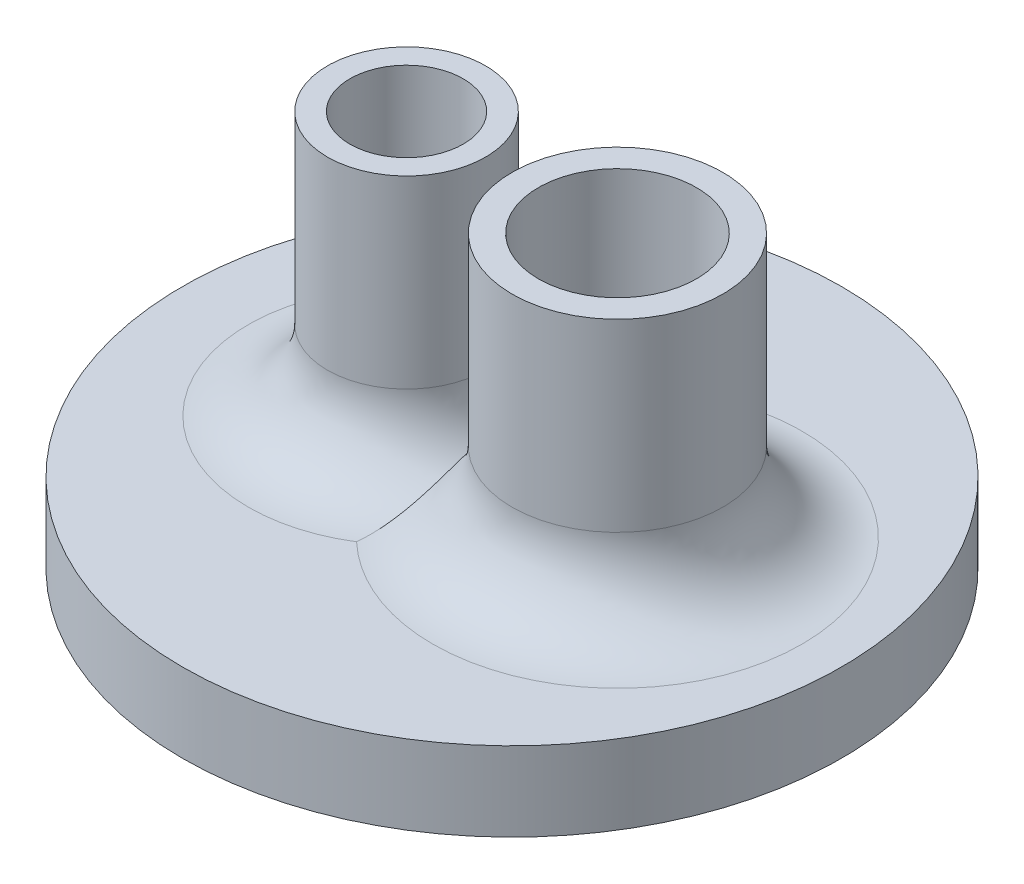
ISO-10303-21;
HEADER;
FILE_DESCRIPTION(('STEP AP214'),'2;1');
FILE_NAME('part.step','',(''),(''),'','','');
FILE_SCHEMA(('AUTOMOTIVE_DESIGN { 1 0 10303 214 1 1 1 1 }'));
ENDSEC;
DATA;
#1=APPLICATION_CONTEXT('core data for automotive mechanical design processes');
#2=APPLICATION_PROTOCOL_DEFINITION('international standard','automotive_design',2000,#1);
#3=PRODUCT_CONTEXT('',#1,'mechanical');
#4=PRODUCT('Part','Part','',(#3));
#5=PRODUCT_RELATED_PRODUCT_CATEGORY('part','',(#4));
#6=PRODUCT_DEFINITION_FORMATION('','',#4);
#7=PRODUCT_DEFINITION_CONTEXT('part definition',#1,'design');
#8=PRODUCT_DEFINITION('design','',#6,#7);
#9=PRODUCT_DEFINITION_SHAPE('','',#8);
#10=(LENGTH_UNIT() NAMED_UNIT(*) SI_UNIT(.MILLI.,.METRE.));
#11=(NAMED_UNIT(*) PLANE_ANGLE_UNIT() SI_UNIT($,.RADIAN.));
#12=(NAMED_UNIT(*) SI_UNIT($,.STERADIAN.) SOLID_ANGLE_UNIT());
#13=UNCERTAINTY_MEASURE_WITH_UNIT(LENGTH_MEASURE(1.E-05),#10,'distance_accuracy_value','');
#14=(GEOMETRIC_REPRESENTATION_CONTEXT(3) GLOBAL_UNCERTAINTY_ASSIGNED_CONTEXT((#13)) GLOBAL_UNIT_ASSIGNED_CONTEXT((#10,
#11,#12)) REPRESENTATION_CONTEXT('',''));
#15=CARTESIAN_POINT('',(0.,0.,0.));
#16=DIRECTION('',(0.,0.,1.));
#17=DIRECTION('',(1.,0.,0.));
#18=AXIS2_PLACEMENT_3D('',#15,#16,#17);
#19=CARTESIAN_POINT('',(0.,3.,0.));
#20=DIRECTION('',(0.,-1.,0.));
#21=DIRECTION('',(0.,0.,-1.));
#22=AXIS2_PLACEMENT_3D('',#19,#20,#21);
#23=CYLINDRICAL_SURFACE('',#22,12.5);
#24=CARTESIAN_POINT('',(0.,3.,0.));
#25=DIRECTION('',(0.,1.,0.));
#26=DIRECTION('',(0.,0.,1.));
#27=AXIS2_PLACEMENT_3D('',#24,#25,#26);
#28=CIRCLE('',#27,12.5);
#29=CARTESIAN_POINT('',(0.,3.,12.5));
#30=VERTEX_POINT('',#29);
#31=EDGE_CURVE('E70',#30,#30,#28,.T.);
#32=ORIENTED_EDGE('',*,*,#31,.F.);
#33=EDGE_LOOP('',(#32));
#34=FACE_BOUND('',#33,.T.);
#35=CARTESIAN_POINT('',(0.,0.,0.));
#36=DIRECTION('',(0.,1.,0.));
#37=DIRECTION('',(0.,0.,1.));
#38=AXIS2_PLACEMENT_3D('',#35,#36,#37);
#39=CIRCLE('',#38,12.5);
#40=CARTESIAN_POINT('',(0.,0.,12.5));
#41=VERTEX_POINT('',#40);
#42=EDGE_CURVE('E71',#41,#41,#39,.T.);
#43=ORIENTED_EDGE('',*,*,#42,.T.);
#44=EDGE_LOOP('',(#43));
#45=FACE_BOUND('',#44,.T.);
#46=ADVANCED_FACE('F33',(#34,#45),#23,.T.);
#47=CARTESIAN_POINT('',(0.,3.,0.));
#48=DIRECTION('',(0.,1.,0.));
#49=DIRECTION('',(0.,0.,1.));
#50=AXIS2_PLACEMENT_3D('',#47,#48,#49);
#51=PLANE('',#50);
#52=CARTESIAN_POINT('',(-4.,3.,0.));
#53=DIRECTION('',(0.,1.,0.));
#54=DIRECTION('',(0.,0.,1.));
#55=AXIS2_PLACEMENT_3D('',#52,#53,#54);
#56=CIRCLE('',#55,6.);
#57=CARTESIAN_POINT('',(-0.812500000000002,3.,5.08329064189724));
#58=VERTEX_POINT('',#57);
#59=CARTESIAN_POINT('',(-0.812500000000002,3.,-5.08329064189724));
#60=VERTEX_POINT('',#59);
#61=EDGE_CURVE('E53',#58,#60,#56,.F.);
#62=ORIENTED_EDGE('',*,*,#61,.T.);
#63=CARTESIAN_POINT('',(4.,3.,0.));
#64=DIRECTION('',(0.,1.,0.));
#65=DIRECTION('',(0.,0.,1.));
#66=AXIS2_PLACEMENT_3D('',#63,#64,#65);
#67=CIRCLE('',#66,7.);
#68=EDGE_CURVE('E47',#60,#58,#67,.F.);
#69=ORIENTED_EDGE('',*,*,#68,.T.);
#70=EDGE_LOOP('',(#62,#69));
#71=FACE_BOUND('',#70,.T.);
#72=ORIENTED_EDGE('',*,*,#31,.T.);
#73=EDGE_LOOP('',(#72));
#74=FACE_BOUND('',#73,.T.);
#75=ADVANCED_FACE('F64',(#71,#74),#51,.T.);
#76=CARTESIAN_POINT('',(0.,0.,0.));
#77=DIRECTION('',(0.,1.,0.));
#78=DIRECTION('',(0.,0.,1.));
#79=AXIS2_PLACEMENT_3D('',#76,#77,#78);
#80=PLANE('',#79);
#81=CARTESIAN_POINT('',(-4.,0.,0.));
#82=DIRECTION('',(0.,1.,0.));
#83=DIRECTION('',(0.,0.,1.));
#84=AXIS2_PLACEMENT_3D('',#81,#82,#83);
#85=CIRCLE('',#84,2.15);
#86=CARTESIAN_POINT('',(-4.,0.,2.15));
#87=VERTEX_POINT('',#86);
#88=EDGE_CURVE('E82',#87,#87,#85,.T.);
#89=ORIENTED_EDGE('',*,*,#88,.T.);
#90=EDGE_LOOP('',(#89));
#91=FACE_BOUND('',#90,.T.);
#92=CARTESIAN_POINT('',(4.,0.,0.));
#93=DIRECTION('',(0.,1.,0.));
#94=DIRECTION('',(0.,0.,1.));
#95=AXIS2_PLACEMENT_3D('',#92,#93,#94);
#96=CIRCLE('',#95,3.);
#97=CARTESIAN_POINT('',(4.,0.,3.));
#98=VERTEX_POINT('',#97);
#99=EDGE_CURVE('E85',#98,#98,#96,.T.);
#100=ORIENTED_EDGE('',*,*,#99,.T.);
#101=EDGE_LOOP('',(#100));
#102=FACE_BOUND('',#101,.T.);
#103=ORIENTED_EDGE('',*,*,#42,.F.);
#104=EDGE_LOOP('',(#103));
#105=FACE_BOUND('',#104,.T.);
#106=ADVANCED_FACE('F94',(#91,#102,#105),#80,.F.);
#107=CARTESIAN_POINT('',(4.,13.,0.));
#108=DIRECTION('',(0.,-1.,0.));
#109=DIRECTION('',(0.,0.,-1.));
#110=AXIS2_PLACEMENT_3D('',#107,#108,#109);
#111=CYLINDRICAL_SURFACE('',#110,4.);
#112=CARTESIAN_POINT('',(4.,6.,0.));
#113=DIRECTION('',(0.,1.,0.));
#114=DIRECTION('',(0.,0.,1.));
#115=AXIS2_PLACEMENT_3D('',#112,#113,#114);
#116=CIRCLE('',#115,4.);
#117=CARTESIAN_POINT('',(4.,6.,4.));
#118=VERTEX_POINT('',#117);
#119=EDGE_CURVE('E62',#118,#118,#116,.T.);
#120=ORIENTED_EDGE('',*,*,#119,.T.);
#121=EDGE_LOOP('',(#120));
#122=FACE_BOUND('',#121,.T.);
#123=CARTESIAN_POINT('',(4.,13.,0.));
#124=DIRECTION('',(0.,1.,0.));
#125=DIRECTION('',(0.,0.,1.));
#126=AXIS2_PLACEMENT_3D('',#123,#124,#125);
#127=CIRCLE('',#126,4.);
#128=CARTESIAN_POINT('',(4.,13.,4.));
#129=VERTEX_POINT('',#128);
#130=EDGE_CURVE('E74',#129,#129,#127,.T.);
#131=ORIENTED_EDGE('',*,*,#130,.F.);
#132=EDGE_LOOP('',(#131));
#133=FACE_BOUND('',#132,.T.);
#134=ADVANCED_FACE('F118',(#122,#133),#111,.T.);
#135=CARTESIAN_POINT('',(4.,13.,0.));
#136=DIRECTION('',(0.,1.,0.));
#137=DIRECTION('',(0.,0.,1.));
#138=AXIS2_PLACEMENT_3D('',#135,#136,#137);
#139=PLANE('',#138);
#140=CARTESIAN_POINT('',(4.,13.,0.));
#141=DIRECTION('',(0.,1.,0.));
#142=DIRECTION('',(0.,0.,1.));
#143=AXIS2_PLACEMENT_3D('',#140,#141,#142);
#144=CIRCLE('',#143,3.);
#145=CARTESIAN_POINT('',(4.,13.,3.));
#146=VERTEX_POINT('',#145);
#147=EDGE_CURVE('E60',#146,#146,#144,.T.);
#148=ORIENTED_EDGE('',*,*,#147,.F.);
#149=EDGE_LOOP('',(#148));
#150=FACE_BOUND('',#149,.T.);
#151=ORIENTED_EDGE('',*,*,#130,.T.);
#152=EDGE_LOOP('',(#151));
#153=FACE_BOUND('',#152,.T.);
#154=ADVANCED_FACE('F112',(#150,#153),#139,.T.);
#155=CARTESIAN_POINT('',(-4.,13.,0.));
#156=DIRECTION('',(0.,-1.,0.));
#157=DIRECTION('',(0.,0.,-1.));
#158=AXIS2_PLACEMENT_3D('',#155,#156,#157);
#159=CYLINDRICAL_SURFACE('',#158,3.);
#160=CARTESIAN_POINT('',(-4.,6.,0.));
#161=DIRECTION('',(0.,1.,0.));
#162=DIRECTION('',(0.,0.,1.));
#163=AXIS2_PLACEMENT_3D('',#160,#161,#162);
#164=CIRCLE('',#163,3.);
#165=CARTESIAN_POINT('',(-4.,6.,3.));
#166=VERTEX_POINT('',#165);
#167=EDGE_CURVE('E11',#166,#166,#164,.T.);
#168=ORIENTED_EDGE('',*,*,#167,.T.);
#169=EDGE_LOOP('',(#168));
#170=FACE_BOUND('',#169,.T.);
#171=CARTESIAN_POINT('',(-4.,13.,0.));
#172=DIRECTION('',(0.,1.,0.));
#173=DIRECTION('',(0.,0.,1.));
#174=AXIS2_PLACEMENT_3D('',#171,#172,#173);
#175=CIRCLE('',#174,3.);
#176=CARTESIAN_POINT('',(-4.,13.,3.));
#177=VERTEX_POINT('',#176);
#178=EDGE_CURVE('E79',#177,#177,#175,.T.);
#179=ORIENTED_EDGE('',*,*,#178,.F.);
#180=EDGE_LOOP('',(#179));
#181=FACE_BOUND('',#180,.T.);
#182=ADVANCED_FACE('F107',(#170,#181),#159,.T.);
#183=CARTESIAN_POINT('',(-4.,13.,0.));
#184=DIRECTION('',(0.,1.,0.));
#185=DIRECTION('',(0.,0.,1.));
#186=AXIS2_PLACEMENT_3D('',#183,#184,#185);
#187=PLANE('',#186);
#188=CARTESIAN_POINT('',(-4.,13.,0.));
#189=DIRECTION('',(0.,1.,0.));
#190=DIRECTION('',(0.,0.,1.));
#191=AXIS2_PLACEMENT_3D('',#188,#189,#190);
#192=CIRCLE('',#191,2.15);
#193=CARTESIAN_POINT('',(-4.,13.,2.15));
#194=VERTEX_POINT('',#193);
#195=EDGE_CURVE('E88',#194,#194,#192,.T.);
#196=ORIENTED_EDGE('',*,*,#195,.F.);
#197=EDGE_LOOP('',(#196));
#198=FACE_BOUND('',#197,.T.);
#199=ORIENTED_EDGE('',*,*,#178,.T.);
#200=EDGE_LOOP('',(#199));
#201=FACE_BOUND('',#200,.T.);
#202=ADVANCED_FACE('F101',(#198,#201),#187,.T.);
#203=CARTESIAN_POINT('',(-4.,0.,0.));
#204=DIRECTION('',(0.,1.,0.));
#205=DIRECTION('',(0.,0.,1.));
#206=AXIS2_PLACEMENT_3D('',#203,#204,#205);
#207=CYLINDRICAL_SURFACE('',#206,2.15);
#208=ORIENTED_EDGE('',*,*,#88,.F.);
#209=EDGE_LOOP('',(#208));
#210=FACE_BOUND('',#209,.T.);
#211=ORIENTED_EDGE('',*,*,#195,.T.);
#212=EDGE_LOOP('',(#211));
#213=FACE_BOUND('',#212,.T.);
#214=ADVANCED_FACE('F97',(#210,#213),#207,.F.);
#215=CARTESIAN_POINT('',(4.,0.,0.));
#216=DIRECTION('',(0.,1.,0.));
#217=DIRECTION('',(0.,0.,1.));
#218=AXIS2_PLACEMENT_3D('',#215,#216,#217);
#219=CYLINDRICAL_SURFACE('',#218,3.);
#220=ORIENTED_EDGE('',*,*,#99,.F.);
#221=EDGE_LOOP('',(#220));
#222=FACE_BOUND('',#221,.T.);
#223=ORIENTED_EDGE('',*,*,#147,.T.);
#224=EDGE_LOOP('',(#223));
#225=FACE_BOUND('',#224,.T.);
#226=ADVANCED_FACE('F100',(#222,#225),#219,.F.);
#227=CARTESIAN_POINT('',(-4.,6.,0.));
#228=DIRECTION('',(0.,1.,0.));
#229=DIRECTION('',(0.,0.,1.));
#230=AXIS2_PLACEMENT_3D('',#227,#228,#229);
#231=TOROIDAL_SURFACE('',#230,6.,3.);
#232=ORIENTED_EDGE('',*,*,#167,.F.);
#233=EDGE_LOOP('',(#232));
#234=FACE_BOUND('',#233,.T.);
#235=CARTESIAN_POINT('',(-0.812500000000002,3.,5.08329064189724));
#236=CARTESIAN_POINT('',(-0.812133287338693,3.00000000055427,5.07959793443101));
#237=CARTESIAN_POINT('',(-0.811766723662009,3.00000430385942,5.07590520359559));
#238=CARTESIAN_POINT('',(-0.805444191295056,3.00015262178634,5.01218614910592));
#239=CARTESIAN_POINT('',(-0.799527838788637,3.00142649045206,4.95215603762001));
#240=CARTESIAN_POINT('',(-0.781880699076312,3.00853001380533,4.77179285467788));
#241=CARTESIAN_POINT('',(-0.770289895820134,3.01765415860402,4.65156495598738));
#242=CARTESIAN_POINT('',(-0.747590615341538,3.04385894926049,4.41207441318945));
#243=CARTESIAN_POINT('',(-0.736481736268768,3.06093282123381,4.29281103507312));
#244=CARTESIAN_POINT('',(-0.705823921545159,3.11933430016125,3.95704153685913));
#245=CARTESIAN_POINT('',(-0.686915788967218,3.16903311431123,3.74191541907357));
#246=CARTESIAN_POINT('',(-0.651302618394487,3.28692464188864,3.31656855791169));
#247=CARTESIAN_POINT('',(-0.63460004680265,3.35513780324144,3.10635351897445));
#248=CARTESIAN_POINT('',(-0.611339235520508,3.46711149400592,2.79330060761636));
#249=CARTESIAN_POINT('',(-0.603852633551964,3.50625854462811,2.68882740044839));
#250=CARTESIAN_POINT('',(-0.589546472616537,3.58679507417856,2.48076541452218));
#251=CARTESIAN_POINT('',(-0.582726570838214,3.62818338347645,2.37717620649634));
#252=CARTESIAN_POINT('',(-0.569780889757735,3.71219740316326,2.1704855161532));
#253=CARTESIAN_POINT('',(-0.563654989326834,3.75482289598167,2.06738395174366));
#254=CARTESIAN_POINT('',(-0.552128236713118,3.8401016510573,1.8611334642059));
#255=CARTESIAN_POINT('',(-0.546727491207718,3.88275491647476,1.75798453634474));
#256=CARTESIAN_POINT('',(-0.536682991760372,3.96663417821602,1.55079641086626));
#257=CARTESIAN_POINT('',(-0.532040934648534,4.00785681712309,1.44675575093362));
#258=CARTESIAN_POINT('',(-0.523585009122809,4.08675667366374,1.23723500810836));
#259=CARTESIAN_POINT('',(-0.51977141628934,4.12443270920051,1.13175445861359));
#260=CARTESIAN_POINT('',(-0.51309566971615,4.19314534260935,0.919905780605405));
#261=CARTESIAN_POINT('',(-0.510223089922687,4.22425323684571,0.813561766304086));
#262=CARTESIAN_POINT('',(-0.505479952171843,4.27710961802961,0.598570767919561));
#263=CARTESIAN_POINT('',(-0.503608215882731,4.29886910525689,0.489926649274876));
#264=CARTESIAN_POINT('',(-0.501261587178605,4.32650751986135,0.29470938444094));
#265=CARTESIAN_POINT('',(-0.500571082185011,4.33481489496427,0.208490279995913));
#266=CARTESIAN_POINT('',(-0.499901842328677,4.34286368084301,0.0356461191635982));
#267=CARTESIAN_POINT('',(-0.499922996175875,4.3426064309652,-0.0509788716322577));
#268=CARTESIAN_POINT('',(-0.500677418804424,4.33353886534021,-0.224112314503004));
#269=CARTESIAN_POINT('',(-0.501413572717292,4.32469389692448,-0.310618872105422));
#270=CARTESIAN_POINT('',(-0.50356616096827,4.2993926506286,-0.482481818626611));
#271=CARTESIAN_POINT('',(-0.504982741906568,4.28293473254225,-0.567837955607365));
#272=CARTESIAN_POINT('',(-0.510091441154791,4.22537931675721,-0.817812227481232));
#273=CARTESIAN_POINT('',(-0.514665379161202,4.17575094959626,-0.980403457804432));
#274=CARTESIAN_POINT('',(-0.523039327314012,4.09241112023856,-1.2210173061587));
#275=CARTESIAN_POINT('',(-0.526087160723139,4.0631097732582,-1.30076552129719));
#276=CARTESIAN_POINT('',(-0.532656967463151,4.00259557409661,-1.45951800211442));
#277=CARTESIAN_POINT('',(-0.536178869781792,3.97138300858367,-1.53852237732247));
#278=CARTESIAN_POINT('',(-0.543699468963451,3.90770542957463,-1.6966971846915));
#279=CARTESIAN_POINT('',(-0.547701617322098,3.87523264294571,-1.77586423863334));
#280=CARTESIAN_POINT('',(-0.556140872824662,3.80999385239509,-1.9340548054872));
#281=CARTESIAN_POINT('',(-0.560577982118326,3.77722784702491,-2.01307831768781));
#282=CARTESIAN_POINT('',(-0.574506584806251,3.67950109187614,-2.25015624553868));
#283=CARTESIAN_POINT('',(-0.584623450511105,3.61504090590622,-2.40838561296262));
#284=CARTESIAN_POINT('',(-0.606994442006513,3.48806712230509,-2.73526090324692));
#285=CARTESIAN_POINT('',(-0.619333483267187,3.42583824908038,-2.9040140846669));
#286=CARTESIAN_POINT('',(-0.645621097060726,3.31074965084826,-3.2447203937501));
#287=CARTESIAN_POINT('',(-0.659570430946471,3.25789438792254,-3.41667500257));
#288=CARTESIAN_POINT('',(-0.688841962267444,3.16501360350821,-3.76299124123976));
#289=CARTESIAN_POINT('',(-0.704156632472546,3.12492270637891,-3.9373356741044));
#290=CARTESIAN_POINT('',(-0.736012600610678,3.0601305478452,-4.28869055334652));
#291=CARTESIAN_POINT('',(-0.752552627336329,3.03541358066284,-4.46569808911876));
#292=CARTESIAN_POINT('',(-0.776401725004587,3.01342440131244,-4.71471375248426));
#293=CARTESIAN_POINT('',(-0.783308389663029,3.00858067589398,-4.78613466232113));
#294=CARTESIAN_POINT('',(-0.797258173256892,3.00195834173198,-4.92911168420416));
#295=CARTESIAN_POINT('',(-0.804301281438822,3.00017949242289,-5.00066778519762));
#296=CARTESIAN_POINT('',(-0.811766725254665,3.00000430074887,-5.07590522040781));
#297=CARTESIAN_POINT('',(-0.81213328900255,2.99999999727578,-5.0795979520005));
#298=CARTESIAN_POINT('',(-0.812500000000004,3.,-5.08329064189724));
#299=B_SPLINE_CURVE_WITH_KNOTS('',3,(#235,#236,#237,#238,#239,#240,#241,#242,#243,#244,#245,
#246,#247,#248,#249,#250,#251,#252,#253,#254,#255,#256,#257,#258,#259,#260,#261,#262,#263,#264,
#265,#266,#267,#268,#269,#270,#271,#272,#273,#274,#275,#276,#277,#278,#279,#280,#281,#282,#283,
#284,#285,#286,#287,#288,#289,#290,#291,#292,#293,#294,#295,#296,#297,#298),.UNSPECIFIED.,.F.,
.F.,(4,2,2,2,2,2,2,2,2,2,2,2,2,2,2,2,2,2,2,2,2,2,2,2,2,2,2,2,2,2,2,4),(0.,0.0111326382173353,
0.192095890166779,0.555159974156783,0.917915259374869,1.58150852597882,2.24583769277769,
2.5812683854946,2.91652568532325,3.25172437998618,3.58697233177008,3.92296010859552,
4.25905947786533,4.59129804220177,4.92314458314427,5.18261827998887,5.4420514002145,
5.70253573947932,5.96307622612287,6.47204406976674,6.72711060118522,6.98213896783118,
7.23912441015512,7.49611112266577,8.00953842444002,8.55020581634044,9.09112989312172,
9.62923719172916,10.166793861146,10.3824978461816,10.5981848995988,10.6093175378162),.UNSPECIFIED.);
#300=EDGE_CURVE('E37',#60,#58,#299,.F.);
#301=ORIENTED_EDGE('',*,*,#300,.F.);
#302=ORIENTED_EDGE('',*,*,#61,.F.);
#303=EDGE_LOOP('',(#301,#302));
#304=FACE_BOUND('',#303,.T.);
#305=ADVANCED_FACE('F61',(#234,#304),#231,.F.);
#306=CARTESIAN_POINT('',(4.,6.,0.));
#307=DIRECTION('',(0.,1.,0.));
#308=DIRECTION('',(0.,0.,1.));
#309=AXIS2_PLACEMENT_3D('',#306,#307,#308);
#310=TOROIDAL_SURFACE('',#309,7.,3.);
#311=ORIENTED_EDGE('',*,*,#68,.F.);
#312=ORIENTED_EDGE('',*,*,#300,.T.);
#313=EDGE_LOOP('',(#311,#312));
#314=FACE_BOUND('',#313,.T.);
#315=ORIENTED_EDGE('',*,*,#119,.F.);
#316=EDGE_LOOP('',(#315));
#317=FACE_BOUND('',#316,.T.);
#318=ADVANCED_FACE('F35',(#314,#317),#310,.F.);
#319=CLOSED_SHELL('',(#46,#75,#106,#134,#154,#182,#202,#214,#226,#305,#318));
#320=MANIFOLD_SOLID_BREP('B2',#319);
#321=ADVANCED_BREP_SHAPE_REPRESENTATION('',(#18,#320),#14);
#322=SHAPE_DEFINITION_REPRESENTATION(#9,#321);
ENDSEC;
END-ISO-10303-21;
